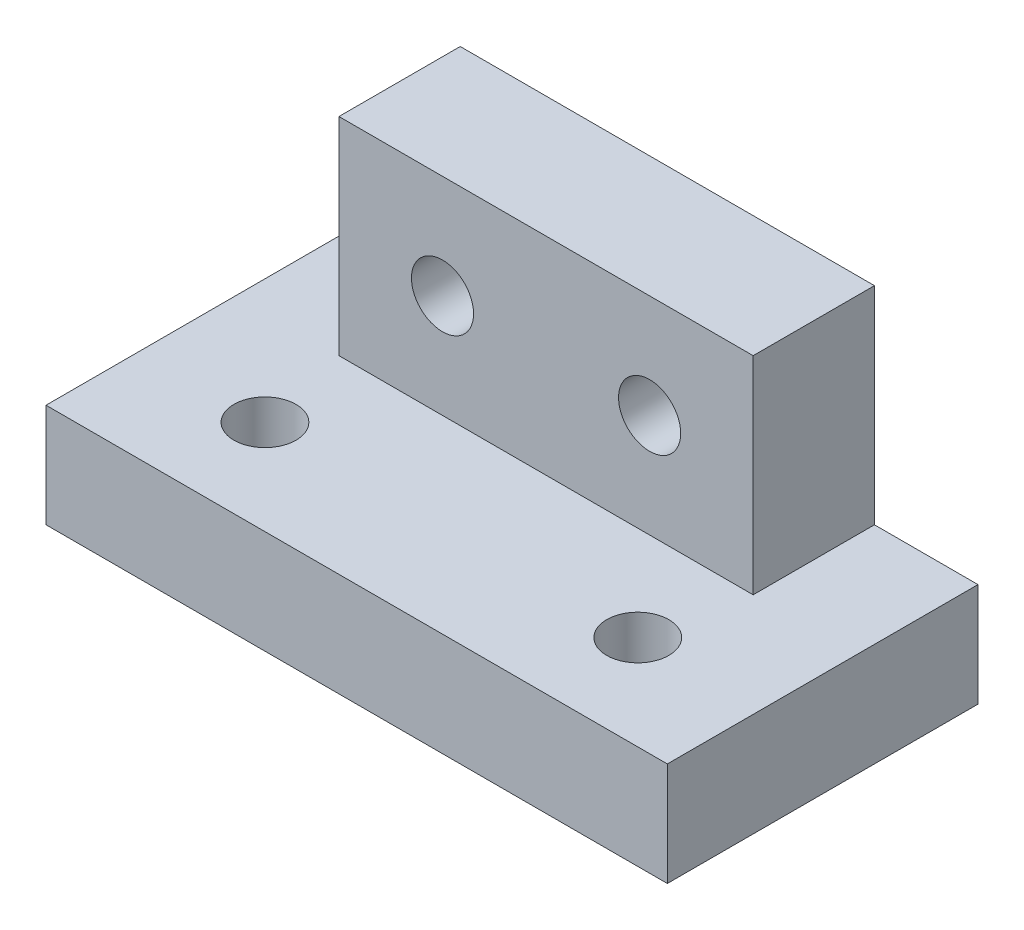
ISO-10303-21;
HEADER;
FILE_DESCRIPTION(('STEP AP214'),'2;1');
FILE_NAME('part.step','',(''),(''),'','','');
FILE_SCHEMA(('AUTOMOTIVE_DESIGN { 1 0 10303 214 1 1 1 1 }'));
ENDSEC;
DATA;
#1=APPLICATION_CONTEXT('core data for automotive mechanical design processes');
#2=APPLICATION_PROTOCOL_DEFINITION('international standard','automotive_design',2000,#1);
#3=PRODUCT_CONTEXT('',#1,'mechanical');
#4=PRODUCT('Part','Part','',(#3));
#5=PRODUCT_RELATED_PRODUCT_CATEGORY('part','',(#4));
#6=PRODUCT_DEFINITION_FORMATION('','',#4);
#7=PRODUCT_DEFINITION_CONTEXT('part definition',#1,'design');
#8=PRODUCT_DEFINITION('design','',#6,#7);
#9=PRODUCT_DEFINITION_SHAPE('','',#8);
#10=(LENGTH_UNIT() NAMED_UNIT(*) SI_UNIT(.MILLI.,.METRE.));
#11=(NAMED_UNIT(*) PLANE_ANGLE_UNIT() SI_UNIT($,.RADIAN.));
#12=(NAMED_UNIT(*) SI_UNIT($,.STERADIAN.) SOLID_ANGLE_UNIT());
#13=UNCERTAINTY_MEASURE_WITH_UNIT(LENGTH_MEASURE(1.E-05),#10,'distance_accuracy_value','');
#14=(GEOMETRIC_REPRESENTATION_CONTEXT(3) GLOBAL_UNCERTAINTY_ASSIGNED_CONTEXT((#13)) GLOBAL_UNIT_ASSIGNED_CONTEXT((#10,
#11,#12)) REPRESENTATION_CONTEXT('',''));
#15=CARTESIAN_POINT('',(0.,0.,0.));
#16=DIRECTION('',(0.,0.,1.));
#17=DIRECTION('',(1.,0.,0.));
#18=AXIS2_PLACEMENT_3D('',#15,#16,#17);
#19=CARTESIAN_POINT('',(0.,5.,0.));
#20=DIRECTION('',(0.,1.,0.));
#21=DIRECTION('',(0.,0.,1.));
#22=AXIS2_PLACEMENT_3D('',#19,#20,#21);
#23=PLANE('',#22);
#24=CARTESIAN_POINT('',(-16.5188648514823,5.,23.1847908290292));
#25=DIRECTION('',(0.,1.,0.));
#26=DIRECTION('',(0.,0.,1.));
#27=AXIS2_PLACEMENT_3D('',#24,#25,#26);
#28=CIRCLE('',#27,1.5);
#29=CARTESIAN_POINT('',(-16.5188648514823,5.,24.6847908290292));
#30=VERTEX_POINT('',#29);
#31=EDGE_CURVE('E250',#30,#30,#28,.T.);
#32=ORIENTED_EDGE('',*,*,#31,.F.);
#33=EDGE_LOOP('',(#32));
#34=FACE_BOUND('',#33,.T.);
#35=CARTESIAN_POINT('',(-34.5188648514823,5.,23.1847908290292));
#36=DIRECTION('',(0.,1.,0.));
#37=DIRECTION('',(0.,0.,1.));
#38=AXIS2_PLACEMENT_3D('',#35,#36,#37);
#39=CIRCLE('',#38,1.5);
#40=CARTESIAN_POINT('',(-34.5188648514823,5.,24.6847908290292));
#41=VERTEX_POINT('',#40);
#42=EDGE_CURVE('E252',#41,#41,#39,.T.);
#43=ORIENTED_EDGE('',*,*,#42,.F.);
#44=EDGE_LOOP('',(#43));
#45=FACE_BOUND('',#44,.T.);
#46=DIRECTION('',(-1.,0.,0.));
#47=VECTOR('',#46,1.);
#48=CARTESIAN_POINT('',(-40.5188648514823,5.,12.7570463335865));
#49=LINE('',#48,#47);
#50=CARTESIAN_POINT('',(-10.5188648514823,5.,12.7570463335865));
#51=VERTEX_POINT('',#50);
#52=CARTESIAN_POINT('',(-15.5188648514823,5.,12.7570463335865));
#53=VERTEX_POINT('',#52);
#54=EDGE_CURVE('E138',#51,#53,#49,.T.);
#55=ORIENTED_EDGE('',*,*,#54,.T.);
#56=DIRECTION('',(0.,0.,1.));
#57=VECTOR('',#56,1.);
#58=CARTESIAN_POINT('',(-15.5188648514823,5.,0.));
#59=LINE('',#58,#57);
#60=CARTESIAN_POINT('',(-15.5188648514823,5.,18.6125353244719));
#61=VERTEX_POINT('',#60);
#62=EDGE_CURVE('E49',#53,#61,#59,.T.);
#63=ORIENTED_EDGE('',*,*,#62,.T.);
#64=DIRECTION('',(1.,0.,0.));
#65=VECTOR('',#64,1.);
#66=CARTESIAN_POINT('',(0.,5.,18.6125353244719));
#67=LINE('',#66,#65);
#68=CARTESIAN_POINT('',(-35.5188648514823,5.,18.6125353244719));
#69=VERTEX_POINT('',#68);
#70=EDGE_CURVE('E199',#69,#61,#67,.T.);
#71=ORIENTED_EDGE('',*,*,#70,.F.);
#72=DIRECTION('',(0.,0.,1.));
#73=VECTOR('',#72,1.);
#74=CARTESIAN_POINT('',(-35.5188648514823,5.,0.));
#75=LINE('',#74,#73);
#76=CARTESIAN_POINT('',(-35.5188648514823,5.,12.7570463335865));
#77=VERTEX_POINT('',#76);
#78=EDGE_CURVE('E55',#77,#69,#75,.T.);
#79=ORIENTED_EDGE('',*,*,#78,.F.);
#80=CARTESIAN_POINT('',(-40.5188648514823,5.,12.7570463335865));
#81=VERTEX_POINT('',#80);
#82=EDGE_CURVE('E120',#77,#81,#49,.T.);
#83=ORIENTED_EDGE('',*,*,#82,.T.);
#84=DIRECTION('',(0.,0.,1.));
#85=VECTOR('',#84,1.);
#86=CARTESIAN_POINT('',(-40.5188648514823,5.,12.7570463335865));
#87=LINE('',#86,#85);
#88=CARTESIAN_POINT('',(-40.5188648514823,5.,27.7570463335865));
#89=VERTEX_POINT('',#88);
#90=EDGE_CURVE('E130',#81,#89,#87,.T.);
#91=ORIENTED_EDGE('',*,*,#90,.T.);
#92=DIRECTION('',(1.,0.,0.));
#93=VECTOR('',#92,1.);
#94=CARTESIAN_POINT('',(-40.5188648514823,5.,27.7570463335865));
#95=LINE('',#94,#93);
#96=CARTESIAN_POINT('',(-10.5188648514823,5.,27.7570463335865));
#97=VERTEX_POINT('',#96);
#98=EDGE_CURVE('E133',#89,#97,#95,.T.);
#99=ORIENTED_EDGE('',*,*,#98,.T.);
#100=DIRECTION('',(0.,0.,-1.));
#101=VECTOR('',#100,1.);
#102=CARTESIAN_POINT('',(-10.5188648514823,5.,12.7570463335865));
#103=LINE('',#102,#101);
#104=EDGE_CURVE('E136',#97,#51,#103,.T.);
#105=ORIENTED_EDGE('',*,*,#104,.T.);
#106=EDGE_LOOP('',(#55,#63,#71,#79,#83,#91,#99,#105));
#107=FACE_BOUND('',#106,.T.);
#108=ADVANCED_FACE('F34',(#34,#45,#107),#23,.T.);
#109=CARTESIAN_POINT('',(-40.5188648514823,5.,12.7570463335865));
#110=DIRECTION('',(1.,0.,0.));
#111=DIRECTION('',(0.,0.,-1.));
#112=AXIS2_PLACEMENT_3D('',#109,#110,#111);
#113=PLANE('',#112);
#114=DIRECTION('',(0.,0.,1.));
#115=VECTOR('',#114,1.);
#116=CARTESIAN_POINT('',(-40.5188648514823,0.,12.7570463335865));
#117=LINE('',#116,#115);
#118=CARTESIAN_POINT('',(-40.5188648514823,0.,12.7570463335865));
#119=VERTEX_POINT('',#118);
#120=CARTESIAN_POINT('',(-40.5188648514823,0.,27.7570463335865));
#121=VERTEX_POINT('',#120);
#122=EDGE_CURVE('E121',#119,#121,#117,.T.);
#123=ORIENTED_EDGE('',*,*,#122,.T.);
#124=DIRECTION('',(0.,-1.,0.));
#125=VECTOR('',#124,1.);
#126=CARTESIAN_POINT('',(-40.5188648514823,5.,27.7570463335865));
#127=LINE('',#126,#125);
#128=EDGE_CURVE('E11',#89,#121,#127,.T.);
#129=ORIENTED_EDGE('',*,*,#128,.F.);
#130=ORIENTED_EDGE('',*,*,#90,.F.);
#131=DIRECTION('',(0.,-1.,0.));
#132=VECTOR('',#131,1.);
#133=CARTESIAN_POINT('',(-40.5188648514823,5.,12.7570463335865));
#134=LINE('',#133,#132);
#135=EDGE_CURVE('E139',#81,#119,#134,.T.);
#136=ORIENTED_EDGE('',*,*,#135,.T.);
#137=EDGE_LOOP('',(#123,#129,#130,#136));
#138=FACE_BOUND('',#137,.T.);
#139=ADVANCED_FACE('F36',(#138),#113,.F.);
#140=CARTESIAN_POINT('',(-40.5188648514823,5.,27.7570463335865));
#141=DIRECTION('',(0.,0.,-1.));
#142=DIRECTION('',(-1.,0.,0.));
#143=AXIS2_PLACEMENT_3D('',#140,#141,#142);
#144=PLANE('',#143);
#145=DIRECTION('',(1.,0.,0.));
#146=VECTOR('',#145,1.);
#147=CARTESIAN_POINT('',(-40.5188648514823,0.,27.7570463335865));
#148=LINE('',#147,#146);
#149=CARTESIAN_POINT('',(-10.5188648514823,0.,27.7570463335865));
#150=VERTEX_POINT('',#149);
#151=EDGE_CURVE('E124',#121,#150,#148,.T.);
#152=ORIENTED_EDGE('',*,*,#151,.T.);
#153=DIRECTION('',(0.,-1.,0.));
#154=VECTOR('',#153,1.);
#155=CARTESIAN_POINT('',(-10.5188648514823,5.,27.7570463335865));
#156=LINE('',#155,#154);
#157=EDGE_CURVE('E42',#97,#150,#156,.T.);
#158=ORIENTED_EDGE('',*,*,#157,.F.);
#159=ORIENTED_EDGE('',*,*,#98,.F.);
#160=ORIENTED_EDGE('',*,*,#128,.T.);
#161=EDGE_LOOP('',(#152,#158,#159,#160));
#162=FACE_BOUND('',#161,.T.);
#163=ADVANCED_FACE('F165',(#162),#144,.F.);
#164=CARTESIAN_POINT('',(-10.5188648514823,5.,12.7570463335865));
#165=DIRECTION('',(-1.,0.,0.));
#166=DIRECTION('',(0.,0.,1.));
#167=AXIS2_PLACEMENT_3D('',#164,#165,#166);
#168=PLANE('',#167);
#169=DIRECTION('',(0.,0.,-1.));
#170=VECTOR('',#169,1.);
#171=CARTESIAN_POINT('',(-10.5188648514823,0.,12.7570463335865));
#172=LINE('',#171,#170);
#173=CARTESIAN_POINT('',(-10.5188648514823,0.,12.7570463335865));
#174=VERTEX_POINT('',#173);
#175=EDGE_CURVE('E142',#150,#174,#172,.T.);
#176=ORIENTED_EDGE('',*,*,#175,.T.);
#177=DIRECTION('',(0.,-1.,0.));
#178=VECTOR('',#177,1.);
#179=CARTESIAN_POINT('',(-10.5188648514823,5.,12.7570463335865));
#180=LINE('',#179,#178);
#181=EDGE_CURVE('E147',#51,#174,#180,.T.);
#182=ORIENTED_EDGE('',*,*,#181,.F.);
#183=ORIENTED_EDGE('',*,*,#104,.F.);
#184=ORIENTED_EDGE('',*,*,#157,.T.);
#185=EDGE_LOOP('',(#176,#182,#183,#184));
#186=FACE_BOUND('',#185,.T.);
#187=ADVANCED_FACE('F154',(#186),#168,.F.);
#188=CARTESIAN_POINT('',(-40.5188648514823,5.,12.7570463335865));
#189=DIRECTION('',(0.,0.,1.));
#190=DIRECTION('',(1.,0.,0.));
#191=AXIS2_PLACEMENT_3D('',#188,#189,#190);
#192=PLANE('',#191);
#193=CARTESIAN_POINT('',(-30.5188648514823,10.,12.7570463335865));
#194=DIRECTION('',(0.,0.,1.));
#195=DIRECTION('',(1.,0.,0.));
#196=AXIS2_PLACEMENT_3D('',#193,#194,#195);
#197=CIRCLE('',#196,1.5);
#198=CARTESIAN_POINT('',(-29.0188648514823,10.,12.7570463335865));
#199=VERTEX_POINT('',#198);
#200=EDGE_CURVE('E192',#199,#199,#197,.T.);
#201=ORIENTED_EDGE('',*,*,#200,.T.);
#202=EDGE_LOOP('',(#201));
#203=FACE_BOUND('',#202,.T.);
#204=CARTESIAN_POINT('',(-20.5188648514823,10.,12.7570463335865));
#205=DIRECTION('',(0.,0.,1.));
#206=DIRECTION('',(1.,0.,0.));
#207=AXIS2_PLACEMENT_3D('',#204,#205,#206);
#208=CIRCLE('',#207,1.5);
#209=CARTESIAN_POINT('',(-19.0188648514823,10.,12.7570463335865));
#210=VERTEX_POINT('',#209);
#211=EDGE_CURVE('E195',#210,#210,#208,.T.);
#212=ORIENTED_EDGE('',*,*,#211,.T.);
#213=EDGE_LOOP('',(#212));
#214=FACE_BOUND('',#213,.T.);
#215=DIRECTION('',(-1.,0.,0.));
#216=VECTOR('',#215,1.);
#217=CARTESIAN_POINT('',(-40.5188648514823,0.,12.7570463335865));
#218=LINE('',#217,#216);
#219=EDGE_CURVE('E134',#174,#119,#218,.T.);
#220=ORIENTED_EDGE('',*,*,#219,.T.);
#221=ORIENTED_EDGE('',*,*,#135,.F.);
#222=ORIENTED_EDGE('',*,*,#82,.F.);
#223=DIRECTION('',(0.,-1.,0.));
#224=VECTOR('',#223,1.);
#225=CARTESIAN_POINT('',(-35.5188648514823,15.,12.7570463335865));
#226=LINE('',#225,#224);
#227=CARTESIAN_POINT('',(-35.5188648514823,15.,12.7570463335865));
#228=VERTEX_POINT('',#227);
#229=EDGE_CURVE('E102',#228,#77,#226,.T.);
#230=ORIENTED_EDGE('',*,*,#229,.F.);
#231=DIRECTION('',(-1.,0.,0.));
#232=VECTOR('',#231,1.);
#233=CARTESIAN_POINT('',(0.,15.,12.7570463335865));
#234=LINE('',#233,#232);
#235=CARTESIAN_POINT('',(-15.5188648514823,15.,12.7570463335865));
#236=VERTEX_POINT('',#235);
#237=EDGE_CURVE('E108',#236,#228,#234,.T.);
#238=ORIENTED_EDGE('',*,*,#237,.F.);
#239=DIRECTION('',(0.,-1.,0.));
#240=VECTOR('',#239,1.);
#241=CARTESIAN_POINT('',(-15.5188648514823,15.,12.7570463335865));
#242=LINE('',#241,#240);
#243=EDGE_CURVE('E206',#236,#53,#242,.T.);
#244=ORIENTED_EDGE('',*,*,#243,.T.);
#245=ORIENTED_EDGE('',*,*,#54,.F.);
#246=ORIENTED_EDGE('',*,*,#181,.T.);
#247=EDGE_LOOP('',(#220,#221,#222,#230,#238,#244,#245,#246));
#248=FACE_BOUND('',#247,.T.);
#249=ADVANCED_FACE('F118',(#203,#214,#248),#192,.F.);
#250=CARTESIAN_POINT('',(0.,0.,0.));
#251=DIRECTION('',(0.,1.,0.));
#252=DIRECTION('',(0.,0.,1.));
#253=AXIS2_PLACEMENT_3D('',#250,#251,#252);
#254=PLANE('',#253);
#255=CARTESIAN_POINT('',(-16.5188648514823,0.,23.1847908290292));
#256=DIRECTION('',(0.,1.,0.));
#257=DIRECTION('',(0.,0.,1.));
#258=AXIS2_PLACEMENT_3D('',#255,#256,#257);
#259=CIRCLE('',#258,1.5);
#260=CARTESIAN_POINT('',(-16.5188648514823,0.,24.6847908290292));
#261=VERTEX_POINT('',#260);
#262=EDGE_CURVE('E248',#261,#261,#259,.T.);
#263=ORIENTED_EDGE('',*,*,#262,.T.);
#264=EDGE_LOOP('',(#263));
#265=FACE_BOUND('',#264,.T.);
#266=CARTESIAN_POINT('',(-34.5188648514823,0.,23.1847908290292));
#267=DIRECTION('',(0.,1.,0.));
#268=DIRECTION('',(0.,0.,1.));
#269=AXIS2_PLACEMENT_3D('',#266,#267,#268);
#270=CIRCLE('',#269,1.5);
#271=CARTESIAN_POINT('',(-34.5188648514823,0.,24.6847908290292));
#272=VERTEX_POINT('',#271);
#273=EDGE_CURVE('E255',#272,#272,#270,.T.);
#274=ORIENTED_EDGE('',*,*,#273,.T.);
#275=EDGE_LOOP('',(#274));
#276=FACE_BOUND('',#275,.T.);
#277=ORIENTED_EDGE('',*,*,#122,.F.);
#278=ORIENTED_EDGE('',*,*,#219,.F.);
#279=ORIENTED_EDGE('',*,*,#175,.F.);
#280=ORIENTED_EDGE('',*,*,#151,.F.);
#281=EDGE_LOOP('',(#277,#278,#279,#280));
#282=FACE_BOUND('',#281,.T.);
#283=ADVANCED_FACE('F160',(#265,#276,#282),#254,.F.);
#284=CARTESIAN_POINT('',(-35.5188648514823,15.,0.));
#285=DIRECTION('',(1.,0.,0.));
#286=DIRECTION('',(0.,0.,-1.));
#287=AXIS2_PLACEMENT_3D('',#284,#285,#286);
#288=PLANE('',#287);
#289=ORIENTED_EDGE('',*,*,#78,.T.);
#290=DIRECTION('',(0.,-1.,0.));
#291=VECTOR('',#290,1.);
#292=CARTESIAN_POINT('',(-35.5188648514823,15.,18.6125353244719));
#293=LINE('',#292,#291);
#294=CARTESIAN_POINT('',(-35.5188648514823,15.,18.6125353244719));
#295=VERTEX_POINT('',#294);
#296=EDGE_CURVE('E104',#295,#69,#293,.T.);
#297=ORIENTED_EDGE('',*,*,#296,.F.);
#298=DIRECTION('',(0.,0.,1.));
#299=VECTOR('',#298,1.);
#300=CARTESIAN_POINT('',(-35.5188648514823,15.,0.));
#301=LINE('',#300,#299);
#302=EDGE_CURVE('E98',#228,#295,#301,.T.);
#303=ORIENTED_EDGE('',*,*,#302,.F.);
#304=ORIENTED_EDGE('',*,*,#229,.T.);
#305=EDGE_LOOP('',(#289,#297,#303,#304));
#306=FACE_BOUND('',#305,.T.);
#307=ADVANCED_FACE('F100',(#306),#288,.F.);
#308=CARTESIAN_POINT('',(0.,15.,18.6125353244719));
#309=DIRECTION('',(0.,0.,-1.));
#310=DIRECTION('',(-1.,0.,0.));
#311=AXIS2_PLACEMENT_3D('',#308,#309,#310);
#312=PLANE('',#311);
#313=CARTESIAN_POINT('',(-30.5188648514823,10.,18.6125353244719));
#314=DIRECTION('',(0.,0.,1.));
#315=DIRECTION('',(1.,0.,0.));
#316=AXIS2_PLACEMENT_3D('',#313,#314,#315);
#317=CIRCLE('',#316,1.5);
#318=CARTESIAN_POINT('',(-29.0188648514823,10.,18.6125353244719));
#319=VERTEX_POINT('',#318);
#320=EDGE_CURVE('E258',#319,#319,#317,.T.);
#321=ORIENTED_EDGE('',*,*,#320,.F.);
#322=EDGE_LOOP('',(#321));
#323=FACE_BOUND('',#322,.T.);
#324=CARTESIAN_POINT('',(-20.5188648514823,10.,18.6125353244719));
#325=DIRECTION('',(0.,0.,1.));
#326=DIRECTION('',(1.,0.,0.));
#327=AXIS2_PLACEMENT_3D('',#324,#325,#326);
#328=CIRCLE('',#327,1.5);
#329=CARTESIAN_POINT('',(-19.0188648514823,10.,18.6125353244719));
#330=VERTEX_POINT('',#329);
#331=EDGE_CURVE('E197',#330,#330,#328,.T.);
#332=ORIENTED_EDGE('',*,*,#331,.F.);
#333=EDGE_LOOP('',(#332));
#334=FACE_BOUND('',#333,.T.);
#335=ORIENTED_EDGE('',*,*,#70,.T.);
#336=DIRECTION('',(0.,-1.,0.));
#337=VECTOR('',#336,1.);
#338=CARTESIAN_POINT('',(-15.5188648514823,15.,18.6125353244719));
#339=LINE('',#338,#337);
#340=CARTESIAN_POINT('',(-15.5188648514823,15.,18.6125353244719));
#341=VERTEX_POINT('',#340);
#342=EDGE_CURVE('E126',#341,#61,#339,.T.);
#343=ORIENTED_EDGE('',*,*,#342,.F.);
#344=DIRECTION('',(1.,0.,0.));
#345=VECTOR('',#344,1.);
#346=CARTESIAN_POINT('',(0.,15.,18.6125353244719));
#347=LINE('',#346,#345);
#348=EDGE_CURVE('E107',#295,#341,#347,.T.);
#349=ORIENTED_EDGE('',*,*,#348,.F.);
#350=ORIENTED_EDGE('',*,*,#296,.T.);
#351=EDGE_LOOP('',(#335,#343,#349,#350));
#352=FACE_BOUND('',#351,.T.);
#353=ADVANCED_FACE('F215',(#323,#334,#352),#312,.F.);
#354=CARTESIAN_POINT('',(-15.5188648514823,15.,0.));
#355=DIRECTION('',(1.,0.,0.));
#356=DIRECTION('',(0.,0.,-1.));
#357=AXIS2_PLACEMENT_3D('',#354,#355,#356);
#358=PLANE('',#357);
#359=ORIENTED_EDGE('',*,*,#62,.F.);
#360=ORIENTED_EDGE('',*,*,#243,.F.);
#361=DIRECTION('',(0.,0.,1.));
#362=VECTOR('',#361,1.);
#363=CARTESIAN_POINT('',(-15.5188648514823,15.,0.));
#364=LINE('',#363,#362);
#365=EDGE_CURVE('E114',#236,#341,#364,.T.);
#366=ORIENTED_EDGE('',*,*,#365,.T.);
#367=ORIENTED_EDGE('',*,*,#342,.T.);
#368=EDGE_LOOP('',(#359,#360,#366,#367));
#369=FACE_BOUND('',#368,.T.);
#370=ADVANCED_FACE('F213',(#369),#358,.T.);
#371=CARTESIAN_POINT('',(0.,15.,0.));
#372=DIRECTION('',(0.,1.,0.));
#373=DIRECTION('',(0.,0.,1.));
#374=AXIS2_PLACEMENT_3D('',#371,#372,#373);
#375=PLANE('',#374);
#376=ORIENTED_EDGE('',*,*,#237,.T.);
#377=ORIENTED_EDGE('',*,*,#302,.T.);
#378=ORIENTED_EDGE('',*,*,#348,.T.);
#379=ORIENTED_EDGE('',*,*,#365,.F.);
#380=EDGE_LOOP('',(#376,#377,#378,#379));
#381=FACE_BOUND('',#380,.T.);
#382=ADVANCED_FACE('F112',(#381),#375,.T.);
#383=CARTESIAN_POINT('',(-20.5188648514823,10.,12.6125353244719));
#384=DIRECTION('',(0.,0.,1.));
#385=DIRECTION('',(1.,0.,0.));
#386=AXIS2_PLACEMENT_3D('',#383,#384,#385);
#387=CYLINDRICAL_SURFACE('',#386,1.5);
#388=ORIENTED_EDGE('',*,*,#331,.T.);
#389=EDGE_LOOP('',(#388));
#390=FACE_BOUND('',#389,.T.);
#391=ORIENTED_EDGE('',*,*,#211,.F.);
#392=EDGE_LOOP('',(#391));
#393=FACE_BOUND('',#392,.T.);
#394=ADVANCED_FACE('F228',(#390,#393),#387,.F.);
#395=CARTESIAN_POINT('',(-30.5188648514823,10.,12.6125353244719));
#396=DIRECTION('',(0.,0.,1.));
#397=DIRECTION('',(1.,0.,0.));
#398=AXIS2_PLACEMENT_3D('',#395,#396,#397);
#399=CYLINDRICAL_SURFACE('',#398,1.5);
#400=ORIENTED_EDGE('',*,*,#320,.T.);
#401=EDGE_LOOP('',(#400));
#402=FACE_BOUND('',#401,.T.);
#403=ORIENTED_EDGE('',*,*,#200,.F.);
#404=EDGE_LOOP('',(#403));
#405=FACE_BOUND('',#404,.T.);
#406=ADVANCED_FACE('F231',(#402,#405),#399,.F.);
#407=CARTESIAN_POINT('',(-34.5188648514823,0.,23.1847908290292));
#408=DIRECTION('',(0.,1.,0.));
#409=DIRECTION('',(0.,0.,1.));
#410=AXIS2_PLACEMENT_3D('',#407,#408,#409);
#411=CYLINDRICAL_SURFACE('',#410,1.5);
#412=ORIENTED_EDGE('',*,*,#273,.F.);
#413=EDGE_LOOP('',(#412));
#414=FACE_BOUND('',#413,.T.);
#415=ORIENTED_EDGE('',*,*,#42,.T.);
#416=EDGE_LOOP('',(#415));
#417=FACE_BOUND('',#416,.T.);
#418=ADVANCED_FACE('F235',(#414,#417),#411,.F.);
#419=CARTESIAN_POINT('',(-16.5188648514823,0.,23.1847908290292));
#420=DIRECTION('',(0.,1.,0.));
#421=DIRECTION('',(0.,0.,1.));
#422=AXIS2_PLACEMENT_3D('',#419,#420,#421);
#423=CYLINDRICAL_SURFACE('',#422,1.5);
#424=ORIENTED_EDGE('',*,*,#262,.F.);
#425=EDGE_LOOP('',(#424));
#426=FACE_BOUND('',#425,.T.);
#427=ORIENTED_EDGE('',*,*,#31,.T.);
#428=EDGE_LOOP('',(#427));
#429=FACE_BOUND('',#428,.T.);
#430=ADVANCED_FACE('F239',(#426,#429),#423,.F.);
#431=CLOSED_SHELL('',(#108,#139,#163,#187,#249,#283,#307,#353,#370,#382,#394,#406,#418,#430));
#432=MANIFOLD_SOLID_BREP('B2',#431);
#433=ADVANCED_BREP_SHAPE_REPRESENTATION('',(#18,#432),#14);
#434=SHAPE_DEFINITION_REPRESENTATION(#9,#433);
ENDSEC;
END-ISO-10303-21;
